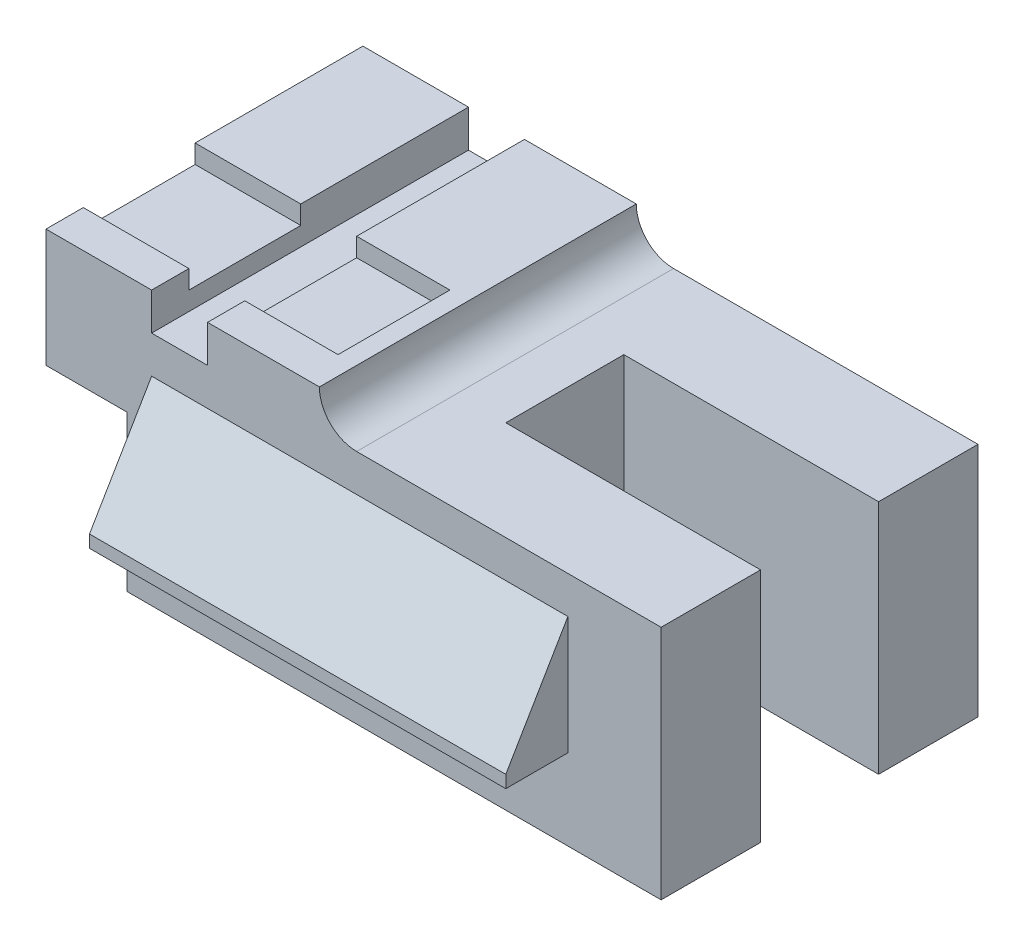
ISO-10303-21;
HEADER;
FILE_DESCRIPTION(('STEP AP214'),'2;1');
FILE_NAME('part.step','',(''),(''),'','','');
FILE_SCHEMA(('AUTOMOTIVE_DESIGN { 1 0 10303 214 1 1 1 1 }'));
ENDSEC;
DATA;
#1=APPLICATION_CONTEXT('core data for automotive mechanical design processes');
#2=APPLICATION_PROTOCOL_DEFINITION('international standard','automotive_design',2000,#1);
#3=PRODUCT_CONTEXT('',#1,'mechanical');
#4=PRODUCT('Part','Part','',(#3));
#5=PRODUCT_RELATED_PRODUCT_CATEGORY('part','',(#4));
#6=PRODUCT_DEFINITION_FORMATION('','',#4);
#7=PRODUCT_DEFINITION_CONTEXT('part definition',#1,'design');
#8=PRODUCT_DEFINITION('design','',#6,#7);
#9=PRODUCT_DEFINITION_SHAPE('','',#8);
#10=(LENGTH_UNIT() NAMED_UNIT(*) SI_UNIT(.MILLI.,.METRE.));
#11=(NAMED_UNIT(*) PLANE_ANGLE_UNIT() SI_UNIT($,.RADIAN.));
#12=(NAMED_UNIT(*) SI_UNIT($,.STERADIAN.) SOLID_ANGLE_UNIT());
#13=UNCERTAINTY_MEASURE_WITH_UNIT(LENGTH_MEASURE(1.E-05),#10,'distance_accuracy_value','');
#14=(GEOMETRIC_REPRESENTATION_CONTEXT(3) GLOBAL_UNCERTAINTY_ASSIGNED_CONTEXT((#13)) GLOBAL_UNIT_ASSIGNED_CONTEXT((#10,
#11,#12)) REPRESENTATION_CONTEXT('',''));
#15=CARTESIAN_POINT('',(0.,0.,0.));
#16=DIRECTION('',(0.,0.,1.));
#17=DIRECTION('',(1.,0.,0.));
#18=AXIS2_PLACEMENT_3D('',#15,#16,#17);
#19=CARTESIAN_POINT('',(0.,44.,0.));
#20=DIRECTION('',(0.,0.,-1.));
#21=DIRECTION('',(-1.,0.,0.));
#22=AXIS2_PLACEMENT_3D('',#19,#20,#21);
#23=PLANE('',#22);
#24=DIRECTION('',(0.,-1.,0.));
#25=VECTOR('',#24,1.);
#26=CARTESIAN_POINT('',(-99.,44.,0.));
#27=LINE('',#26,#25);
#28=CARTESIAN_POINT('',(-99.,44.,0.));
#29=VERTEX_POINT('',#28);
#30=CARTESIAN_POINT('',(-99.,25.,0.));
#31=VERTEX_POINT('',#30);
#32=EDGE_CURVE('E419',#29,#31,#27,.T.);
#33=ORIENTED_EDGE('',*,*,#32,.T.);
#34=DIRECTION('',(-1.,0.,0.));
#35=VECTOR('',#34,1.);
#36=CARTESIAN_POINT('',(-99.,25.,0.));
#37=LINE('',#36,#35);
#38=CARTESIAN_POINT('',(-86.,25.,0.));
#39=VERTEX_POINT('',#38);
#40=EDGE_CURVE('E270',#39,#31,#37,.T.);
#41=ORIENTED_EDGE('',*,*,#40,.F.);
#42=DIRECTION('',(0.,1.,0.));
#43=VECTOR('',#42,1.);
#44=CARTESIAN_POINT('',(-86.,0.,0.));
#45=LINE('',#44,#43);
#46=CARTESIAN_POINT('',(-86.,0.,0.));
#47=VERTEX_POINT('',#46);
#48=EDGE_CURVE('E265',#47,#39,#45,.T.);
#49=ORIENTED_EDGE('',*,*,#48,.F.);
#50=DIRECTION('',(1.,0.,0.));
#51=VECTOR('',#50,1.);
#52=CARTESIAN_POINT('',(0.,0.,0.));
#53=LINE('',#52,#51);
#54=CARTESIAN_POINT('',(0.,0.,0.));
#55=VERTEX_POINT('',#54);
#56=EDGE_CURVE('E415',#47,#55,#53,.T.);
#57=ORIENTED_EDGE('',*,*,#56,.T.);
#58=DIRECTION('',(0.,-1.,0.));
#59=VECTOR('',#58,1.);
#60=CARTESIAN_POINT('',(0.,44.,0.));
#61=LINE('',#60,#59);
#62=CARTESIAN_POINT('',(0.,38.,0.));
#63=VERTEX_POINT('',#62);
#64=EDGE_CURVE('E408',#63,#55,#61,.T.);
#65=ORIENTED_EDGE('',*,*,#64,.F.);
#66=DIRECTION('',(1.,0.,0.));
#67=VECTOR('',#66,1.);
#68=CARTESIAN_POINT('',(0.,38.,0.));
#69=LINE('',#68,#67);
#70=CARTESIAN_POINT('',(-49.,38.,0.));
#71=VERTEX_POINT('',#70);
#72=EDGE_CURVE('E392',#71,#63,#69,.T.);
#73=ORIENTED_EDGE('',*,*,#72,.F.);
#74=CARTESIAN_POINT('',(-49.,44.,0.));
#75=DIRECTION('',(0.,0.,-1.));
#76=DIRECTION('',(-1.,0.,0.));
#77=AXIS2_PLACEMENT_3D('',#74,#75,#76);
#78=CIRCLE('',#77,6.);
#79=CARTESIAN_POINT('',(-55.,44.,0.));
#80=VERTEX_POINT('',#79);
#81=EDGE_CURVE('E45',#71,#80,#78,.T.);
#82=ORIENTED_EDGE('',*,*,#81,.T.);
#83=DIRECTION('',(1.,0.,0.));
#84=VECTOR('',#83,1.);
#85=CARTESIAN_POINT('',(0.,44.,0.));
#86=LINE('',#85,#84);
#87=CARTESIAN_POINT('',(-73.,44.,0.));
#88=VERTEX_POINT('',#87);
#89=EDGE_CURVE('E404',#88,#80,#86,.T.);
#90=ORIENTED_EDGE('',*,*,#89,.F.);
#91=DIRECTION('',(0.,1.,0.));
#92=VECTOR('',#91,1.);
#93=CARTESIAN_POINT('',(-73.,38.,0.));
#94=LINE('',#93,#92);
#95=CARTESIAN_POINT('',(-73.,38.,0.));
#96=VERTEX_POINT('',#95);
#97=EDGE_CURVE('E335',#96,#88,#94,.T.);
#98=ORIENTED_EDGE('',*,*,#97,.F.);
#99=DIRECTION('',(1.,0.,0.));
#100=VECTOR('',#99,1.);
#101=CARTESIAN_POINT('',(-82.,38.,0.));
#102=LINE('',#101,#100);
#103=CARTESIAN_POINT('',(-82.,38.,0.));
#104=VERTEX_POINT('',#103);
#105=EDGE_CURVE('E314',#104,#96,#102,.T.);
#106=ORIENTED_EDGE('',*,*,#105,.F.);
#107=DIRECTION('',(0.,1.,0.));
#108=VECTOR('',#107,1.);
#109=CARTESIAN_POINT('',(-82.,38.,0.));
#110=LINE('',#109,#108);
#111=CARTESIAN_POINT('',(-82.,44.,0.));
#112=VERTEX_POINT('',#111);
#113=EDGE_CURVE('E324',#104,#112,#110,.T.);
#114=ORIENTED_EDGE('',*,*,#113,.T.);
#115=EDGE_CURVE('E405',#29,#112,#86,.T.);
#116=ORIENTED_EDGE('',*,*,#115,.F.);
#117=EDGE_LOOP('',(#33,#41,#49,#57,#65,#73,#82,#90,#98,#106,#114,#116));
#118=FACE_BOUND('',#117,.T.);
#119=DIRECTION('',(0.,-1.,0.));
#120=VECTOR('',#119,1.);
#121=CARTESIAN_POINT('',(-82.,32.,0.));
#122=LINE('',#121,#120);
#123=CARTESIAN_POINT('',(-82.,32.,0.));
#124=VERTEX_POINT('',#123);
#125=CARTESIAN_POINT('',(-82.,13.,0.));
#126=VERTEX_POINT('',#125);
#127=EDGE_CURVE('E254',#124,#126,#122,.T.);
#128=ORIENTED_EDGE('',*,*,#127,.F.);
#129=DIRECTION('',(-1.,0.,0.));
#130=VECTOR('',#129,1.);
#131=CARTESIAN_POINT('',(-82.,32.,0.));
#132=LINE('',#131,#130);
#133=CARTESIAN_POINT('',(-15.,32.,0.));
#134=VERTEX_POINT('',#133);
#135=EDGE_CURVE('E261',#134,#124,#132,.T.);
#136=ORIENTED_EDGE('',*,*,#135,.F.);
#137=DIRECTION('',(0.,1.,0.));
#138=VECTOR('',#137,1.);
#139=CARTESIAN_POINT('',(-15.,32.,0.));
#140=LINE('',#139,#138);
#141=CARTESIAN_POINT('',(-15.,13.,0.));
#142=VERTEX_POINT('',#141);
#143=EDGE_CURVE('E240',#142,#134,#140,.T.);
#144=ORIENTED_EDGE('',*,*,#143,.F.);
#145=DIRECTION('',(1.,0.,0.));
#146=VECTOR('',#145,1.);
#147=CARTESIAN_POINT('',(-82.,13.,0.));
#148=LINE('',#147,#146);
#149=EDGE_CURVE('E257',#126,#142,#148,.T.);
#150=ORIENTED_EDGE('',*,*,#149,.F.);
#151=EDGE_LOOP('',(#128,#136,#144,#150));
#152=FACE_BOUND('',#151,.T.);
#153=ADVANCED_FACE('F37',(#118,#152),#23,.F.);
#154=CARTESIAN_POINT('',(0.,44.,0.));
#155=DIRECTION('',(-1.,0.,0.));
#156=DIRECTION('',(0.,0.,1.));
#157=AXIS2_PLACEMENT_3D('',#154,#155,#156);
#158=PLANE('',#157);
#159=DIRECTION('',(0.,0.,-1.));
#160=VECTOR('',#159,1.);
#161=CARTESIAN_POINT('',(0.,0.,0.));
#162=LINE('',#161,#160);
#163=CARTESIAN_POINT('',(0.,0.,-16.));
#164=VERTEX_POINT('',#163);
#165=EDGE_CURVE('E409',#55,#164,#162,.T.);
#166=ORIENTED_EDGE('',*,*,#165,.T.);
#167=DIRECTION('',(0.,1.,0.));
#168=VECTOR('',#167,1.);
#169=CARTESIAN_POINT('',(0.,0.,-16.));
#170=LINE('',#169,#168);
#171=CARTESIAN_POINT('',(0.,38.,-16.));
#172=VERTEX_POINT('',#171);
#173=EDGE_CURVE('E302',#164,#172,#170,.T.);
#174=ORIENTED_EDGE('',*,*,#173,.T.);
#175=DIRECTION('',(0.,0.,-1.));
#176=VECTOR('',#175,1.);
#177=CARTESIAN_POINT('',(0.,38.,-51.));
#178=LINE('',#177,#176);
#179=EDGE_CURVE('E386',#63,#172,#178,.T.);
#180=ORIENTED_EDGE('',*,*,#179,.F.);
#181=ORIENTED_EDGE('',*,*,#64,.T.);
#182=EDGE_LOOP('',(#166,#174,#180,#181));
#183=FACE_BOUND('',#182,.T.);
#184=ADVANCED_FACE('F528',(#183),#158,.F.);
#185=CARTESIAN_POINT('',(0.,44.,0.));
#186=DIRECTION('',(0.,1.,0.));
#187=DIRECTION('',(0.,0.,1.));
#188=AXIS2_PLACEMENT_3D('',#185,#186,#187);
#189=PLANE('',#188);
#190=DIRECTION('',(0.,0.,1.));
#191=VECTOR('',#190,1.);
#192=CARTESIAN_POINT('',(-82.,44.,-51.));
#193=LINE('',#192,#191);
#194=CARTESIAN_POINT('',(-82.,44.,-5.99999999999999));
#195=VERTEX_POINT('',#194);
#196=EDGE_CURVE('E305',#195,#112,#193,.T.);
#197=ORIENTED_EDGE('',*,*,#196,.F.);
#198=DIRECTION('',(1.,0.,0.));
#199=VECTOR('',#198,1.);
#200=CARTESIAN_POINT('',(-99.,44.,-5.99999999999999));
#201=LINE('',#200,#199);
#202=CARTESIAN_POINT('',(-99.,44.,-5.99999999999999));
#203=VERTEX_POINT('',#202);
#204=EDGE_CURVE('E367',#203,#195,#201,.T.);
#205=ORIENTED_EDGE('',*,*,#204,.F.);
#206=DIRECTION('',(0.,0.,1.));
#207=VECTOR('',#206,1.);
#208=CARTESIAN_POINT('',(-99.,44.,0.));
#209=LINE('',#208,#207);
#210=EDGE_CURVE('E399',#203,#29,#209,.T.);
#211=ORIENTED_EDGE('',*,*,#210,.T.);
#212=ORIENTED_EDGE('',*,*,#115,.T.);
#213=EDGE_LOOP('',(#197,#205,#211,#212));
#214=FACE_BOUND('',#213,.T.);
#215=ADVANCED_FACE('F494',(#214),#189,.T.);
#216=CARTESIAN_POINT('',(-82.,44.,-51.));
#217=VERTEX_POINT('',#216);
#218=CARTESIAN_POINT('',(-82.,44.,-24.));
#219=VERTEX_POINT('',#218);
#220=EDGE_CURVE('E325',#217,#219,#193,.T.);
#221=ORIENTED_EDGE('',*,*,#220,.F.);
#222=DIRECTION('',(-1.,0.,0.));
#223=VECTOR('',#222,1.);
#224=CARTESIAN_POINT('',(0.,44.,-51.));
#225=LINE('',#224,#223);
#226=CARTESIAN_POINT('',(-99.,44.,-51.));
#227=VERTEX_POINT('',#226);
#228=EDGE_CURVE('E400',#217,#227,#225,.T.);
#229=ORIENTED_EDGE('',*,*,#228,.T.);
#230=CARTESIAN_POINT('',(-99.,44.,-24.));
#231=VERTEX_POINT('',#230);
#232=EDGE_CURVE('E401',#227,#231,#209,.T.);
#233=ORIENTED_EDGE('',*,*,#232,.T.);
#234=DIRECTION('',(-1.,0.,0.));
#235=VECTOR('',#234,1.);
#236=CARTESIAN_POINT('',(-99.,44.,-24.));
#237=LINE('',#236,#235);
#238=EDGE_CURVE('E373',#219,#231,#237,.T.);
#239=ORIENTED_EDGE('',*,*,#238,.F.);
#240=EDGE_LOOP('',(#221,#229,#233,#239));
#241=FACE_BOUND('',#240,.T.);
#242=ADVANCED_FACE('F476',(#241),#189,.T.);
#243=CARTESIAN_POINT('',(-99.,41.,-24.));
#244=DIRECTION('',(0.,0.,-1.));
#245=DIRECTION('',(-1.,0.,0.));
#246=AXIS2_PLACEMENT_3D('',#243,#244,#245);
#247=PLANE('',#246);
#248=DIRECTION('',(-1.,0.,0.));
#249=VECTOR('',#248,1.);
#250=CARTESIAN_POINT('',(-99.,41.,-24.));
#251=LINE('',#250,#249);
#252=CARTESIAN_POINT('',(-82.,41.,-24.));
#253=VERTEX_POINT('',#252);
#254=CARTESIAN_POINT('',(-99.,41.,-24.));
#255=VERTEX_POINT('',#254);
#256=EDGE_CURVE('E362',#253,#255,#251,.T.);
#257=ORIENTED_EDGE('',*,*,#256,.F.);
#258=DIRECTION('',(0.,1.,0.));
#259=VECTOR('',#258,1.);
#260=CARTESIAN_POINT('',(-82.,41.,-24.));
#261=LINE('',#260,#259);
#262=EDGE_CURVE('E347',#253,#219,#261,.T.);
#263=ORIENTED_EDGE('',*,*,#262,.T.);
#264=ORIENTED_EDGE('',*,*,#238,.T.);
#265=DIRECTION('',(0.,1.,0.));
#266=VECTOR('',#265,1.);
#267=CARTESIAN_POINT('',(-99.,41.,-24.));
#268=LINE('',#267,#266);
#269=EDGE_CURVE('E376',#255,#231,#268,.T.);
#270=ORIENTED_EDGE('',*,*,#269,.F.);
#271=EDGE_LOOP('',(#257,#263,#264,#270));
#272=FACE_BOUND('',#271,.T.);
#273=ADVANCED_FACE('F483',(#272),#247,.F.);
#274=CARTESIAN_POINT('',(-99.,41.,-5.99999999999999));
#275=DIRECTION('',(0.,0.,1.));
#276=DIRECTION('',(1.,0.,0.));
#277=AXIS2_PLACEMENT_3D('',#274,#275,#276);
#278=PLANE('',#277);
#279=ORIENTED_EDGE('',*,*,#204,.T.);
#280=DIRECTION('',(0.,-1.,0.));
#281=VECTOR('',#280,1.);
#282=CARTESIAN_POINT('',(-82.,41.,-5.99999999999999));
#283=LINE('',#282,#281);
#284=CARTESIAN_POINT('',(-82.,41.,-5.99999999999999));
#285=VERTEX_POINT('',#284);
#286=EDGE_CURVE('E344',#195,#285,#283,.T.);
#287=ORIENTED_EDGE('',*,*,#286,.T.);
#288=DIRECTION('',(1.,0.,0.));
#289=VECTOR('',#288,1.);
#290=CARTESIAN_POINT('',(-99.,41.,-5.99999999999999));
#291=LINE('',#290,#289);
#292=CARTESIAN_POINT('',(-99.,41.,-5.99999999999999));
#293=VERTEX_POINT('',#292);
#294=EDGE_CURVE('E356',#293,#285,#291,.T.);
#295=ORIENTED_EDGE('',*,*,#294,.F.);
#296=DIRECTION('',(0.,1.,0.));
#297=VECTOR('',#296,1.);
#298=CARTESIAN_POINT('',(-99.,41.,-5.99999999999999));
#299=LINE('',#298,#297);
#300=EDGE_CURVE('E366',#293,#203,#299,.T.);
#301=ORIENTED_EDGE('',*,*,#300,.T.);
#302=EDGE_LOOP('',(#279,#287,#295,#301));
#303=FACE_BOUND('',#302,.T.);
#304=ADVANCED_FACE('F491',(#303),#278,.F.);
#305=CARTESIAN_POINT('',(0.,41.,0.));
#306=DIRECTION('',(0.,1.,0.));
#307=DIRECTION('',(0.,0.,1.));
#308=AXIS2_PLACEMENT_3D('',#305,#306,#307);
#309=PLANE('',#308);
#310=DIRECTION('',(0.,0.,1.));
#311=VECTOR('',#310,1.);
#312=CARTESIAN_POINT('',(-82.,41.,0.));
#313=LINE('',#312,#311);
#314=EDGE_CURVE('E232',#253,#285,#313,.T.);
#315=ORIENTED_EDGE('',*,*,#314,.F.);
#316=ORIENTED_EDGE('',*,*,#256,.T.);
#317=DIRECTION('',(0.,0.,1.));
#318=VECTOR('',#317,1.);
#319=CARTESIAN_POINT('',(-99.,41.,-24.));
#320=LINE('',#319,#318);
#321=EDGE_CURVE('E351',#255,#293,#320,.T.);
#322=ORIENTED_EDGE('',*,*,#321,.T.);
#323=ORIENTED_EDGE('',*,*,#294,.T.);
#324=EDGE_LOOP('',(#315,#316,#322,#323));
#325=FACE_BOUND('',#324,.T.);
#326=ADVANCED_FACE('F487',(#325),#309,.T.);
#327=CARTESIAN_POINT('',(0.,38.,-35.));
#328=VERTEX_POINT('',#327);
#329=CARTESIAN_POINT('',(0.,38.,-51.));
#330=VERTEX_POINT('',#329);
#331=EDGE_CURVE('E390',#328,#330,#178,.T.);
#332=ORIENTED_EDGE('',*,*,#331,.F.);
#333=DIRECTION('',(0.,1.,0.));
#334=VECTOR('',#333,1.);
#335=CARTESIAN_POINT('',(0.,0.,-35.));
#336=LINE('',#335,#334);
#337=CARTESIAN_POINT('',(0.,0.,-35.));
#338=VERTEX_POINT('',#337);
#339=EDGE_CURVE('E295',#338,#328,#336,.T.);
#340=ORIENTED_EDGE('',*,*,#339,.F.);
#341=CARTESIAN_POINT('',(0.,0.,-51.));
#342=VERTEX_POINT('',#341);
#343=EDGE_CURVE('E394',#338,#342,#162,.T.);
#344=ORIENTED_EDGE('',*,*,#343,.T.);
#345=DIRECTION('',(0.,-1.,0.));
#346=VECTOR('',#345,1.);
#347=CARTESIAN_POINT('',(0.,44.,-51.));
#348=LINE('',#347,#346);
#349=EDGE_CURVE('E424',#330,#342,#348,.T.);
#350=ORIENTED_EDGE('',*,*,#349,.F.);
#351=EDGE_LOOP('',(#332,#340,#344,#350));
#352=FACE_BOUND('',#351,.T.);
#353=ADVANCED_FACE('F450',(#352),#158,.F.);
#354=CARTESIAN_POINT('',(0.,44.,-51.));
#355=DIRECTION('',(0.,0.,1.));
#356=DIRECTION('',(1.,0.,0.));
#357=AXIS2_PLACEMENT_3D('',#354,#355,#356);
#358=PLANE('',#357);
#359=DIRECTION('',(0.,1.,0.));
#360=VECTOR('',#359,1.);
#361=CARTESIAN_POINT('',(-86.,0.,-51.));
#362=LINE('',#361,#360);
#363=CARTESIAN_POINT('',(-86.,0.,-51.));
#364=VERTEX_POINT('',#363);
#365=CARTESIAN_POINT('',(-86.,25.,-51.));
#366=VERTEX_POINT('',#365);
#367=EDGE_CURVE('E266',#364,#366,#362,.T.);
#368=ORIENTED_EDGE('',*,*,#367,.T.);
#369=DIRECTION('',(-1.,0.,0.));
#370=VECTOR('',#369,1.);
#371=CARTESIAN_POINT('',(-99.,25.,-51.));
#372=LINE('',#371,#370);
#373=CARTESIAN_POINT('',(-99.,25.,-51.));
#374=VERTEX_POINT('',#373);
#375=EDGE_CURVE('E269',#366,#374,#372,.T.);
#376=ORIENTED_EDGE('',*,*,#375,.T.);
#377=DIRECTION('',(0.,-1.,0.));
#378=VECTOR('',#377,1.);
#379=CARTESIAN_POINT('',(-99.,44.,-51.));
#380=LINE('',#379,#378);
#381=EDGE_CURVE('E421',#227,#374,#380,.T.);
#382=ORIENTED_EDGE('',*,*,#381,.F.);
#383=ORIENTED_EDGE('',*,*,#228,.F.);
#384=DIRECTION('',(0.,1.,0.));
#385=VECTOR('',#384,1.);
#386=CARTESIAN_POINT('',(-82.,38.,-51.));
#387=LINE('',#386,#385);
#388=CARTESIAN_POINT('',(-82.,38.,-51.));
#389=VERTEX_POINT('',#388);
#390=EDGE_CURVE('E329',#389,#217,#387,.T.);
#391=ORIENTED_EDGE('',*,*,#390,.F.);
#392=DIRECTION('',(-1.,0.,0.));
#393=VECTOR('',#392,1.);
#394=CARTESIAN_POINT('',(-82.,38.,-51.));
#395=LINE('',#394,#393);
#396=CARTESIAN_POINT('',(-73.,38.,-51.));
#397=VERTEX_POINT('',#396);
#398=EDGE_CURVE('E321',#397,#389,#395,.T.);
#399=ORIENTED_EDGE('',*,*,#398,.F.);
#400=DIRECTION('',(0.,1.,0.));
#401=VECTOR('',#400,1.);
#402=CARTESIAN_POINT('',(-73.,38.,-51.));
#403=LINE('',#402,#401);
#404=CARTESIAN_POINT('',(-73.,44.,-51.));
#405=VERTEX_POINT('',#404);
#406=EDGE_CURVE('E332',#397,#405,#403,.T.);
#407=ORIENTED_EDGE('',*,*,#406,.T.);
#408=CARTESIAN_POINT('',(-55.,44.,-51.));
#409=VERTEX_POINT('',#408);
#410=EDGE_CURVE('E396',#409,#405,#225,.T.);
#411=ORIENTED_EDGE('',*,*,#410,.F.);
#412=CARTESIAN_POINT('',(-49.,44.,-51.));
#413=DIRECTION('',(0.,0.,1.));
#414=DIRECTION('',(1.,0.,0.));
#415=AXIS2_PLACEMENT_3D('',#412,#413,#414);
#416=CIRCLE('',#415,6.);
#417=CARTESIAN_POINT('',(-49.,38.,-51.));
#418=VERTEX_POINT('',#417);
#419=EDGE_CURVE('E11',#409,#418,#416,.T.);
#420=ORIENTED_EDGE('',*,*,#419,.T.);
#421=DIRECTION('',(-1.,0.,0.));
#422=VECTOR('',#421,1.);
#423=CARTESIAN_POINT('',(0.,38.,-51.));
#424=LINE('',#423,#422);
#425=EDGE_CURVE('E389',#330,#418,#424,.T.);
#426=ORIENTED_EDGE('',*,*,#425,.F.);
#427=ORIENTED_EDGE('',*,*,#349,.T.);
#428=DIRECTION('',(-1.,0.,0.));
#429=VECTOR('',#428,1.);
#430=CARTESIAN_POINT('',(0.,0.,-51.));
#431=LINE('',#430,#429);
#432=EDGE_CURVE('E412',#342,#364,#431,.T.);
#433=ORIENTED_EDGE('',*,*,#432,.T.);
#434=EDGE_LOOP('',(#368,#376,#382,#383,#391,#399,#407,#411,#420,#426,#427,#433));
#435=FACE_BOUND('',#434,.T.);
#436=ADVANCED_FACE('F447',(#435),#358,.F.);
#437=CARTESIAN_POINT('',(-99.,44.,0.));
#438=DIRECTION('',(1.,0.,0.));
#439=DIRECTION('',(0.,0.,-1.));
#440=AXIS2_PLACEMENT_3D('',#437,#438,#439);
#441=PLANE('',#440);
#442=ORIENTED_EDGE('',*,*,#381,.T.);
#443=DIRECTION('',(0.,0.,1.));
#444=VECTOR('',#443,1.);
#445=CARTESIAN_POINT('',(-99.,25.,-51.));
#446=LINE('',#445,#444);
#447=EDGE_CURVE('E278',#374,#31,#446,.T.);
#448=ORIENTED_EDGE('',*,*,#447,.T.);
#449=ORIENTED_EDGE('',*,*,#32,.F.);
#450=ORIENTED_EDGE('',*,*,#210,.F.);
#451=ORIENTED_EDGE('',*,*,#300,.F.);
#452=ORIENTED_EDGE('',*,*,#321,.F.);
#453=ORIENTED_EDGE('',*,*,#269,.T.);
#454=ORIENTED_EDGE('',*,*,#232,.F.);
#455=EDGE_LOOP('',(#442,#448,#449,#450,#451,#452,#453,#454));
#456=FACE_BOUND('',#455,.T.);
#457=ADVANCED_FACE('F467',(#456),#441,.F.);
#458=DIRECTION('',(0.,0.,-1.));
#459=VECTOR('',#458,1.);
#460=CARTESIAN_POINT('',(-73.,44.,-51.));
#461=LINE('',#460,#459);
#462=CARTESIAN_POINT('',(-73.,44.,-6.));
#463=VERTEX_POINT('',#462);
#464=EDGE_CURVE('E315',#88,#463,#461,.T.);
#465=ORIENTED_EDGE('',*,*,#464,.F.);
#466=ORIENTED_EDGE('',*,*,#89,.T.);
#467=DIRECTION('',(0.,0.,1.));
#468=VECTOR('',#467,1.);
#469=CARTESIAN_POINT('',(-55.,44.,-51.));
#470=LINE('',#469,#468);
#471=EDGE_CURVE('E379',#409,#80,#470,.T.);
#472=ORIENTED_EDGE('',*,*,#471,.F.);
#473=ORIENTED_EDGE('',*,*,#410,.T.);
#474=CARTESIAN_POINT('',(-73.,44.,-24.));
#475=VERTEX_POINT('',#474);
#476=EDGE_CURVE('E327',#475,#405,#461,.T.);
#477=ORIENTED_EDGE('',*,*,#476,.F.);
#478=CARTESIAN_POINT('',(-58.,44.,-24.));
#479=VERTEX_POINT('',#478);
#480=EDGE_CURVE('E355',#479,#475,#237,.T.);
#481=ORIENTED_EDGE('',*,*,#480,.F.);
#482=DIRECTION('',(0.,0.,-1.));
#483=VECTOR('',#482,1.);
#484=CARTESIAN_POINT('',(-58.,44.,-24.));
#485=LINE('',#484,#483);
#486=CARTESIAN_POINT('',(-58.,44.,-5.99999999999999));
#487=VERTEX_POINT('',#486);
#488=EDGE_CURVE('E370',#487,#479,#485,.T.);
#489=ORIENTED_EDGE('',*,*,#488,.F.);
#490=EDGE_CURVE('E350',#463,#487,#201,.T.);
#491=ORIENTED_EDGE('',*,*,#490,.F.);
#492=EDGE_LOOP('',(#465,#466,#472,#473,#477,#481,#489,#491));
#493=FACE_BOUND('',#492,.T.);
#494=ADVANCED_FACE('F439',(#493),#189,.T.);
#495=CARTESIAN_POINT('',(0.,0.,0.));
#496=DIRECTION('',(0.,1.,0.));
#497=DIRECTION('',(0.,0.,1.));
#498=AXIS2_PLACEMENT_3D('',#495,#496,#497);
#499=PLANE('',#498);
#500=ORIENTED_EDGE('',*,*,#56,.F.);
#501=DIRECTION('',(0.,0.,1.));
#502=VECTOR('',#501,1.);
#503=CARTESIAN_POINT('',(-86.,0.,-51.));
#504=LINE('',#503,#502);
#505=EDGE_CURVE('E273',#364,#47,#504,.T.);
#506=ORIENTED_EDGE('',*,*,#505,.F.);
#507=ORIENTED_EDGE('',*,*,#432,.F.);
#508=ORIENTED_EDGE('',*,*,#343,.F.);
#509=DIRECTION('',(-1.,0.,0.));
#510=VECTOR('',#509,1.);
#511=CARTESIAN_POINT('',(0.,0.,-35.));
#512=LINE('',#511,#510);
#513=CARTESIAN_POINT('',(-41.,0.,-35.));
#514=VERTEX_POINT('',#513);
#515=EDGE_CURVE('E285',#338,#514,#512,.T.);
#516=ORIENTED_EDGE('',*,*,#515,.T.);
#517=DIRECTION('',(0.,0.,1.));
#518=VECTOR('',#517,1.);
#519=CARTESIAN_POINT('',(-41.,0.,-35.));
#520=LINE('',#519,#518);
#521=CARTESIAN_POINT('',(-41.,0.,-16.));
#522=VERTEX_POINT('',#521);
#523=EDGE_CURVE('E288',#514,#522,#520,.T.);
#524=ORIENTED_EDGE('',*,*,#523,.T.);
#525=DIRECTION('',(1.,0.,0.));
#526=VECTOR('',#525,1.);
#527=CARTESIAN_POINT('',(0.,0.,-16.));
#528=LINE('',#527,#526);
#529=EDGE_CURVE('E292',#522,#164,#528,.T.);
#530=ORIENTED_EDGE('',*,*,#529,.T.);
#531=ORIENTED_EDGE('',*,*,#165,.F.);
#532=EDGE_LOOP('',(#500,#506,#507,#508,#516,#524,#530,#531));
#533=FACE_BOUND('',#532,.T.);
#534=ADVANCED_FACE('F455',(#533),#499,.F.);
#535=CARTESIAN_POINT('',(0.,38.,0.));
#536=DIRECTION('',(0.,-1.,0.));
#537=DIRECTION('',(0.,0.,-1.));
#538=AXIS2_PLACEMENT_3D('',#535,#536,#537);
#539=PLANE('',#538);
#540=ORIENTED_EDGE('',*,*,#425,.T.);
#541=DIRECTION('',(0.,0.,1.));
#542=VECTOR('',#541,1.);
#543=CARTESIAN_POINT('',(-49.,38.,0.));
#544=LINE('',#543,#542);
#545=EDGE_CURVE('E231',#418,#71,#544,.T.);
#546=ORIENTED_EDGE('',*,*,#545,.T.);
#547=ORIENTED_EDGE('',*,*,#72,.T.);
#548=ORIENTED_EDGE('',*,*,#179,.T.);
#549=DIRECTION('',(1.,0.,0.));
#550=VECTOR('',#549,1.);
#551=CARTESIAN_POINT('',(0.,38.,-16.));
#552=LINE('',#551,#550);
#553=CARTESIAN_POINT('',(-41.,38.,-16.));
#554=VERTEX_POINT('',#553);
#555=EDGE_CURVE('E289',#554,#172,#552,.T.);
#556=ORIENTED_EDGE('',*,*,#555,.F.);
#557=DIRECTION('',(0.,0.,1.));
#558=VECTOR('',#557,1.);
#559=CARTESIAN_POINT('',(-41.,38.,-35.));
#560=LINE('',#559,#558);
#561=CARTESIAN_POINT('',(-41.,38.,-35.));
#562=VERTEX_POINT('',#561);
#563=EDGE_CURVE('E298',#562,#554,#560,.T.);
#564=ORIENTED_EDGE('',*,*,#563,.F.);
#565=DIRECTION('',(-1.,0.,0.));
#566=VECTOR('',#565,1.);
#567=CARTESIAN_POINT('',(0.,38.,-35.));
#568=LINE('',#567,#566);
#569=EDGE_CURVE('E281',#328,#562,#568,.T.);
#570=ORIENTED_EDGE('',*,*,#569,.F.);
#571=ORIENTED_EDGE('',*,*,#331,.T.);
#572=EDGE_LOOP('',(#540,#546,#547,#548,#556,#564,#570,#571));
#573=FACE_BOUND('',#572,.T.);
#574=ADVANCED_FACE('F442',(#573),#539,.F.);
#575=ORIENTED_EDGE('',*,*,#480,.T.);
#576=DIRECTION('',(0.,-1.,0.));
#577=VECTOR('',#576,1.);
#578=CARTESIAN_POINT('',(-73.,41.,-24.));
#579=LINE('',#578,#577);
#580=CARTESIAN_POINT('',(-73.,41.,-24.));
#581=VERTEX_POINT('',#580);
#582=EDGE_CURVE('E341',#475,#581,#579,.T.);
#583=ORIENTED_EDGE('',*,*,#582,.T.);
#584=CARTESIAN_POINT('',(-58.,41.,-24.));
#585=VERTEX_POINT('',#584);
#586=EDGE_CURVE('E363',#585,#581,#251,.T.);
#587=ORIENTED_EDGE('',*,*,#586,.F.);
#588=DIRECTION('',(0.,1.,0.));
#589=VECTOR('',#588,1.);
#590=CARTESIAN_POINT('',(-58.,41.,-24.));
#591=LINE('',#590,#589);
#592=EDGE_CURVE('E380',#585,#479,#591,.T.);
#593=ORIENTED_EDGE('',*,*,#592,.T.);
#594=EDGE_LOOP('',(#575,#583,#587,#593));
#595=FACE_BOUND('',#594,.T.);
#596=ADVANCED_FACE('F503',(#595),#247,.F.);
#597=CARTESIAN_POINT('',(-58.,41.,-24.));
#598=DIRECTION('',(1.,0.,0.));
#599=DIRECTION('',(0.,0.,-1.));
#600=AXIS2_PLACEMENT_3D('',#597,#598,#599);
#601=PLANE('',#600);
#602=ORIENTED_EDGE('',*,*,#488,.T.);
#603=ORIENTED_EDGE('',*,*,#592,.F.);
#604=DIRECTION('',(0.,0.,-1.));
#605=VECTOR('',#604,1.);
#606=CARTESIAN_POINT('',(-58.,41.,-24.));
#607=LINE('',#606,#605);
#608=CARTESIAN_POINT('',(-58.,41.,-5.99999999999999));
#609=VERTEX_POINT('',#608);
#610=EDGE_CURVE('E359',#609,#585,#607,.T.);
#611=ORIENTED_EDGE('',*,*,#610,.F.);
#612=DIRECTION('',(0.,1.,0.));
#613=VECTOR('',#612,1.);
#614=CARTESIAN_POINT('',(-58.,41.,-5.99999999999999));
#615=LINE('',#614,#613);
#616=EDGE_CURVE('E382',#609,#487,#615,.T.);
#617=ORIENTED_EDGE('',*,*,#616,.T.);
#618=EDGE_LOOP('',(#602,#603,#611,#617));
#619=FACE_BOUND('',#618,.T.);
#620=ADVANCED_FACE('F507',(#619),#601,.F.);
#621=CARTESIAN_POINT('',(-73.,41.,-5.99999999999999));
#622=VERTEX_POINT('',#621);
#623=EDGE_CURVE('E354',#622,#609,#291,.T.);
#624=ORIENTED_EDGE('',*,*,#623,.F.);
#625=DIRECTION('',(0.,1.,0.));
#626=VECTOR('',#625,1.);
#627=CARTESIAN_POINT('',(-73.,41.,-5.99999999999999));
#628=LINE('',#627,#626);
#629=EDGE_CURVE('E331',#622,#463,#628,.T.);
#630=ORIENTED_EDGE('',*,*,#629,.T.);
#631=ORIENTED_EDGE('',*,*,#490,.T.);
#632=ORIENTED_EDGE('',*,*,#616,.F.);
#633=EDGE_LOOP('',(#624,#630,#631,#632));
#634=FACE_BOUND('',#633,.T.);
#635=ADVANCED_FACE('F511',(#634),#278,.F.);
#636=DIRECTION('',(0.,0.,-1.));
#637=VECTOR('',#636,1.);
#638=CARTESIAN_POINT('',(-73.,41.,0.));
#639=LINE('',#638,#637);
#640=EDGE_CURVE('E427',#622,#581,#639,.T.);
#641=ORIENTED_EDGE('',*,*,#640,.F.);
#642=ORIENTED_EDGE('',*,*,#623,.T.);
#643=ORIENTED_EDGE('',*,*,#610,.T.);
#644=ORIENTED_EDGE('',*,*,#586,.T.);
#645=EDGE_LOOP('',(#641,#642,#643,#644));
#646=FACE_BOUND('',#645,.T.);
#647=ADVANCED_FACE('F515',(#646),#309,.T.);
#648=CARTESIAN_POINT('',(-82.,38.,-51.));
#649=DIRECTION('',(-1.,0.,0.));
#650=DIRECTION('',(0.,0.,1.));
#651=AXIS2_PLACEMENT_3D('',#648,#649,#650);
#652=PLANE('',#651);
#653=ORIENTED_EDGE('',*,*,#314,.T.);
#654=ORIENTED_EDGE('',*,*,#286,.F.);
#655=ORIENTED_EDGE('',*,*,#196,.T.);
#656=ORIENTED_EDGE('',*,*,#113,.F.);
#657=DIRECTION('',(0.,0.,1.));
#658=VECTOR('',#657,1.);
#659=CARTESIAN_POINT('',(-82.,38.,-51.));
#660=LINE('',#659,#658);
#661=EDGE_CURVE('E311',#389,#104,#660,.T.);
#662=ORIENTED_EDGE('',*,*,#661,.F.);
#663=ORIENTED_EDGE('',*,*,#390,.T.);
#664=ORIENTED_EDGE('',*,*,#220,.T.);
#665=ORIENTED_EDGE('',*,*,#262,.F.);
#666=EDGE_LOOP('',(#653,#654,#655,#656,#662,#663,#664,#665));
#667=FACE_BOUND('',#666,.T.);
#668=ADVANCED_FACE('F479',(#667),#652,.F.);
#669=CARTESIAN_POINT('',(-73.,38.,-51.));
#670=DIRECTION('',(1.,0.,0.));
#671=DIRECTION('',(0.,0.,-1.));
#672=AXIS2_PLACEMENT_3D('',#669,#670,#671);
#673=PLANE('',#672);
#674=ORIENTED_EDGE('',*,*,#476,.T.);
#675=ORIENTED_EDGE('',*,*,#406,.F.);
#676=DIRECTION('',(0.,0.,-1.));
#677=VECTOR('',#676,1.);
#678=CARTESIAN_POINT('',(-73.,38.,-51.));
#679=LINE('',#678,#677);
#680=EDGE_CURVE('E318',#96,#397,#679,.T.);
#681=ORIENTED_EDGE('',*,*,#680,.F.);
#682=ORIENTED_EDGE('',*,*,#97,.T.);
#683=ORIENTED_EDGE('',*,*,#464,.T.);
#684=ORIENTED_EDGE('',*,*,#629,.F.);
#685=ORIENTED_EDGE('',*,*,#640,.T.);
#686=ORIENTED_EDGE('',*,*,#582,.F.);
#687=EDGE_LOOP('',(#674,#675,#681,#682,#683,#684,#685,#686));
#688=FACE_BOUND('',#687,.T.);
#689=ADVANCED_FACE('F513',(#688),#673,.F.);
#690=CARTESIAN_POINT('',(0.,38.,0.));
#691=DIRECTION('',(0.,1.,0.));
#692=DIRECTION('',(0.,0.,1.));
#693=AXIS2_PLACEMENT_3D('',#690,#691,#692);
#694=PLANE('',#693);
#695=ORIENTED_EDGE('',*,*,#661,.T.);
#696=ORIENTED_EDGE('',*,*,#105,.T.);
#697=ORIENTED_EDGE('',*,*,#680,.T.);
#698=ORIENTED_EDGE('',*,*,#398,.T.);
#699=EDGE_LOOP('',(#695,#696,#697,#698));
#700=FACE_BOUND('',#699,.T.);
#701=ADVANCED_FACE('F497',(#700),#694,.T.);
#702=CARTESIAN_POINT('',(0.,0.,-16.));
#703=DIRECTION('',(0.,0.,1.));
#704=DIRECTION('',(1.,0.,0.));
#705=AXIS2_PLACEMENT_3D('',#702,#703,#704);
#706=PLANE('',#705);
#707=ORIENTED_EDGE('',*,*,#555,.T.);
#708=ORIENTED_EDGE('',*,*,#173,.F.);
#709=ORIENTED_EDGE('',*,*,#529,.F.);
#710=DIRECTION('',(0.,1.,0.));
#711=VECTOR('',#710,1.);
#712=CARTESIAN_POINT('',(-41.,0.,-16.));
#713=LINE('',#712,#711);
#714=EDGE_CURVE('E306',#522,#554,#713,.T.);
#715=ORIENTED_EDGE('',*,*,#714,.T.);
#716=EDGE_LOOP('',(#707,#708,#709,#715));
#717=FACE_BOUND('',#716,.T.);
#718=ADVANCED_FACE('F551',(#717),#706,.F.);
#719=CARTESIAN_POINT('',(-41.,0.,-35.));
#720=DIRECTION('',(-1.,0.,0.));
#721=DIRECTION('',(0.,0.,1.));
#722=AXIS2_PLACEMENT_3D('',#719,#720,#721);
#723=PLANE('',#722);
#724=ORIENTED_EDGE('',*,*,#563,.T.);
#725=ORIENTED_EDGE('',*,*,#714,.F.);
#726=ORIENTED_EDGE('',*,*,#523,.F.);
#727=DIRECTION('',(0.,1.,0.));
#728=VECTOR('',#727,1.);
#729=CARTESIAN_POINT('',(-41.,0.,-35.));
#730=LINE('',#729,#728);
#731=EDGE_CURVE('E308',#514,#562,#730,.T.);
#732=ORIENTED_EDGE('',*,*,#731,.T.);
#733=EDGE_LOOP('',(#724,#725,#726,#732));
#734=FACE_BOUND('',#733,.T.);
#735=ADVANCED_FACE('F556',(#734),#723,.F.);
#736=CARTESIAN_POINT('',(0.,0.,-35.));
#737=DIRECTION('',(0.,0.,-1.));
#738=DIRECTION('',(-1.,0.,0.));
#739=AXIS2_PLACEMENT_3D('',#736,#737,#738);
#740=PLANE('',#739);
#741=ORIENTED_EDGE('',*,*,#569,.T.);
#742=ORIENTED_EDGE('',*,*,#731,.F.);
#743=ORIENTED_EDGE('',*,*,#515,.F.);
#744=ORIENTED_EDGE('',*,*,#339,.T.);
#745=EDGE_LOOP('',(#741,#742,#743,#744));
#746=FACE_BOUND('',#745,.T.);
#747=ADVANCED_FACE('F569',(#746),#740,.F.);
#748=CARTESIAN_POINT('',(-99.,25.,-51.));
#749=DIRECTION('',(0.,1.,0.));
#750=DIRECTION('',(0.,0.,1.));
#751=AXIS2_PLACEMENT_3D('',#748,#749,#750);
#752=PLANE('',#751);
#753=ORIENTED_EDGE('',*,*,#40,.T.);
#754=ORIENTED_EDGE('',*,*,#447,.F.);
#755=ORIENTED_EDGE('',*,*,#375,.F.);
#756=DIRECTION('',(0.,0.,1.));
#757=VECTOR('',#756,1.);
#758=CARTESIAN_POINT('',(-86.,25.,-51.));
#759=LINE('',#758,#757);
#760=EDGE_CURVE('E282',#366,#39,#759,.T.);
#761=ORIENTED_EDGE('',*,*,#760,.T.);
#762=EDGE_LOOP('',(#753,#754,#755,#761));
#763=FACE_BOUND('',#762,.T.);
#764=ADVANCED_FACE('F464',(#763),#752,.F.);
#765=CARTESIAN_POINT('',(-86.,0.,-51.));
#766=DIRECTION('',(1.,0.,0.));
#767=DIRECTION('',(0.,0.,-1.));
#768=AXIS2_PLACEMENT_3D('',#765,#766,#767);
#769=PLANE('',#768);
#770=ORIENTED_EDGE('',*,*,#48,.T.);
#771=ORIENTED_EDGE('',*,*,#760,.F.);
#772=ORIENTED_EDGE('',*,*,#367,.F.);
#773=ORIENTED_EDGE('',*,*,#505,.T.);
#774=EDGE_LOOP('',(#770,#771,#772,#773));
#775=FACE_BOUND('',#774,.T.);
#776=ADVANCED_FACE('F460',(#775),#769,.F.);
#777=CARTESIAN_POINT('',(-82.,32.,10.));
#778=DIRECTION('',(1.,0.,0.));
#779=DIRECTION('',(0.,0.,-1.));
#780=AXIS2_PLACEMENT_3D('',#777,#778,#779);
#781=PLANE('',#780);
#782=DIRECTION('',(0.,-1.,0.));
#783=VECTOR('',#782,1.);
#784=CARTESIAN_POINT('',(-82.,32.,10.));
#785=LINE('',#784,#783);
#786=CARTESIAN_POINT('',(-82.,15.,10.));
#787=VERTEX_POINT('',#786);
#788=CARTESIAN_POINT('',(-82.,13.,10.));
#789=VERTEX_POINT('',#788);
#790=EDGE_CURVE('E250',#787,#789,#785,.T.);
#791=ORIENTED_EDGE('',*,*,#790,.F.);
#792=DIRECTION('',(0.,0.86193421515777,-0.507020126563394));
#793=VECTOR('',#792,1.);
#794=CARTESIAN_POINT('',(-82.,27.6298200514139,2.5706940874036));
#795=LINE('',#794,#793);
#796=EDGE_CURVE('E227',#787,#124,#795,.T.);
#797=ORIENTED_EDGE('',*,*,#796,.T.);
#798=ORIENTED_EDGE('',*,*,#127,.T.);
#799=DIRECTION('',(0.,0.,-1.));
#800=VECTOR('',#799,1.);
#801=CARTESIAN_POINT('',(-82.,13.,10.));
#802=LINE('',#801,#800);
#803=EDGE_CURVE('E248',#789,#126,#802,.T.);
#804=ORIENTED_EDGE('',*,*,#803,.F.);
#805=EDGE_LOOP('',(#791,#797,#798,#804));
#806=FACE_BOUND('',#805,.T.);
#807=ADVANCED_FACE('F606',(#806),#781,.F.);
#808=CARTESIAN_POINT('',(-82.,13.,10.));
#809=DIRECTION('',(0.,1.,0.));
#810=DIRECTION('',(0.,0.,1.));
#811=AXIS2_PLACEMENT_3D('',#808,#809,#810);
#812=PLANE('',#811);
#813=ORIENTED_EDGE('',*,*,#149,.T.);
#814=DIRECTION('',(0.,0.,-1.));
#815=VECTOR('',#814,1.);
#816=CARTESIAN_POINT('',(-15.,13.,10.));
#817=LINE('',#816,#815);
#818=CARTESIAN_POINT('',(-15.,13.,10.));
#819=VERTEX_POINT('',#818);
#820=EDGE_CURVE('E246',#819,#142,#817,.T.);
#821=ORIENTED_EDGE('',*,*,#820,.F.);
#822=DIRECTION('',(1.,0.,0.));
#823=VECTOR('',#822,1.);
#824=CARTESIAN_POINT('',(-82.,13.,10.));
#825=LINE('',#824,#823);
#826=EDGE_CURVE('E244',#789,#819,#825,.T.);
#827=ORIENTED_EDGE('',*,*,#826,.F.);
#828=ORIENTED_EDGE('',*,*,#803,.T.);
#829=EDGE_LOOP('',(#813,#821,#827,#828));
#830=FACE_BOUND('',#829,.T.);
#831=ADVANCED_FACE('F614',(#830),#812,.F.);
#832=CARTESIAN_POINT('',(-15.,32.,10.));
#833=DIRECTION('',(-1.,0.,0.));
#834=DIRECTION('',(0.,0.,1.));
#835=AXIS2_PLACEMENT_3D('',#832,#833,#834);
#836=PLANE('',#835);
#837=ORIENTED_EDGE('',*,*,#143,.T.);
#838=DIRECTION('',(0.,0.86193421515777,-0.507020126563394));
#839=VECTOR('',#838,1.);
#840=CARTESIAN_POINT('',(-15.,32.,0.));
#841=LINE('',#840,#839);
#842=CARTESIAN_POINT('',(-15.,15.,10.));
#843=VERTEX_POINT('',#842);
#844=EDGE_CURVE('E224',#843,#134,#841,.T.);
#845=ORIENTED_EDGE('',*,*,#844,.F.);
#846=DIRECTION('',(0.,1.,0.));
#847=VECTOR('',#846,1.);
#848=CARTESIAN_POINT('',(-15.,32.,10.));
#849=LINE('',#848,#847);
#850=EDGE_CURVE('E239',#819,#843,#849,.T.);
#851=ORIENTED_EDGE('',*,*,#850,.F.);
#852=ORIENTED_EDGE('',*,*,#820,.T.);
#853=EDGE_LOOP('',(#837,#845,#851,#852));
#854=FACE_BOUND('',#853,.T.);
#855=ADVANCED_FACE('F237',(#854),#836,.F.);
#856=CARTESIAN_POINT('',(0.,0.,10.));
#857=DIRECTION('',(0.,0.,1.));
#858=DIRECTION('',(1.,0.,0.));
#859=AXIS2_PLACEMENT_3D('',#856,#857,#858);
#860=PLANE('',#859);
#861=DIRECTION('',(1.,0.,0.));
#862=VECTOR('',#861,1.);
#863=CARTESIAN_POINT('',(0.,15.,10.));
#864=LINE('',#863,#862);
#865=EDGE_CURVE('E221',#787,#843,#864,.T.);
#866=ORIENTED_EDGE('',*,*,#865,.F.);
#867=ORIENTED_EDGE('',*,*,#790,.T.);
#868=ORIENTED_EDGE('',*,*,#826,.T.);
#869=ORIENTED_EDGE('',*,*,#850,.T.);
#870=EDGE_LOOP('',(#866,#867,#868,#869));
#871=FACE_BOUND('',#870,.T.);
#872=ADVANCED_FACE('F242',(#871),#860,.T.);
#873=CARTESIAN_POINT('',(-99.,32.,0.));
#874=DIRECTION('',(0.,-0.507020126563394,-0.861934215157769));
#875=DIRECTION('',(0.,0.86193421515777,-0.507020126563394));
#876=AXIS2_PLACEMENT_3D('',#873,#874,#875);
#877=PLANE('',#876);
#878=ORIENTED_EDGE('',*,*,#865,.T.);
#879=ORIENTED_EDGE('',*,*,#844,.T.);
#880=ORIENTED_EDGE('',*,*,#135,.T.);
#881=ORIENTED_EDGE('',*,*,#796,.F.);
#882=EDGE_LOOP('',(#878,#879,#880,#881));
#883=FACE_BOUND('',#882,.T.);
#884=ADVANCED_FACE('F223',(#883),#877,.F.);
#885=CARTESIAN_POINT('',(-49.,44.,0.));
#886=DIRECTION('',(0.,0.,-1.));
#887=DIRECTION('',(-1.,0.,0.));
#888=AXIS2_PLACEMENT_3D('',#885,#886,#887);
#889=CYLINDRICAL_SURFACE('',#888,6.);
#890=ORIENTED_EDGE('',*,*,#419,.F.);
#891=ORIENTED_EDGE('',*,*,#471,.T.);
#892=ORIENTED_EDGE('',*,*,#81,.F.);
#893=ORIENTED_EDGE('',*,*,#545,.F.);
#894=EDGE_LOOP('',(#890,#891,#892,#893));
#895=FACE_BOUND('',#894,.T.);
#896=ADVANCED_FACE('F39',(#895),#889,.F.);
#897=CLOSED_SHELL('',(#153,#184,#215,#242,#273,#304,#326,#353,#436,#457,#494,#534,#574,#596,
#620,#635,#647,#668,#689,#701,#718,#735,#747,#764,#776,#807,#831,#855,#872,#884,#896));
#898=MANIFOLD_SOLID_BREP('B2',#897);
#899=ADVANCED_BREP_SHAPE_REPRESENTATION('',(#18,#898),#14);
#900=SHAPE_DEFINITION_REPRESENTATION(#9,#899);
ENDSEC;
END-ISO-10303-21;
